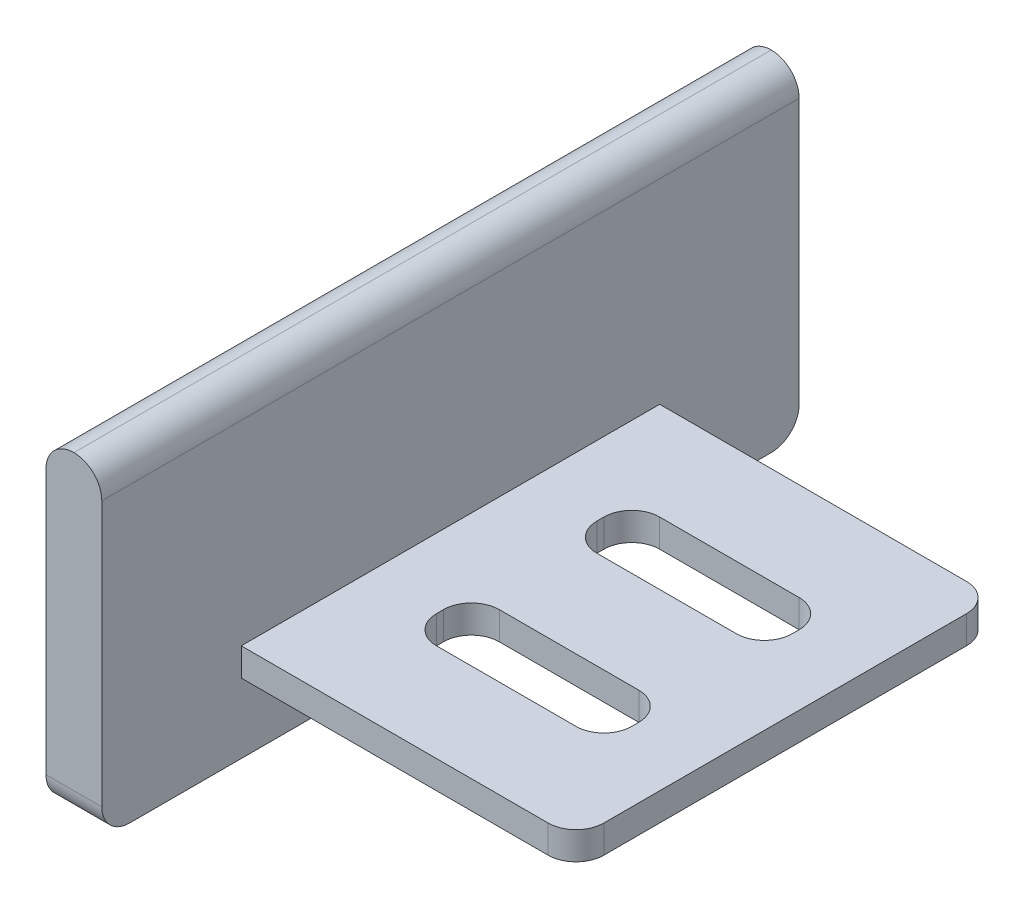
ISO-10303-21;
HEADER;
FILE_DESCRIPTION(('STEP AP214'),'2;1');
FILE_NAME('part.step','',(''),(''),'','','');
FILE_SCHEMA(('AUTOMOTIVE_DESIGN { 1 0 10303 214 1 1 1 1 }'));
ENDSEC;
DATA;
#1=APPLICATION_CONTEXT('core data for automotive mechanical design processes');
#2=APPLICATION_PROTOCOL_DEFINITION('international standard','automotive_design',2000,#1);
#3=PRODUCT_CONTEXT('',#1,'mechanical');
#4=PRODUCT('Part','Part','',(#3));
#5=PRODUCT_RELATED_PRODUCT_CATEGORY('part','',(#4));
#6=PRODUCT_DEFINITION_FORMATION('','',#4);
#7=PRODUCT_DEFINITION_CONTEXT('part definition',#1,'design');
#8=PRODUCT_DEFINITION('design','',#6,#7);
#9=PRODUCT_DEFINITION_SHAPE('','',#8);
#10=(LENGTH_UNIT() NAMED_UNIT(*) SI_UNIT(.MILLI.,.METRE.));
#11=(NAMED_UNIT(*) PLANE_ANGLE_UNIT() SI_UNIT($,.RADIAN.));
#12=(NAMED_UNIT(*) SI_UNIT($,.STERADIAN.) SOLID_ANGLE_UNIT());
#13=UNCERTAINTY_MEASURE_WITH_UNIT(LENGTH_MEASURE(1.E-05),#10,'distance_accuracy_value','');
#14=(GEOMETRIC_REPRESENTATION_CONTEXT(3) GLOBAL_UNCERTAINTY_ASSIGNED_CONTEXT((#13)) GLOBAL_UNIT_ASSIGNED_CONTEXT((#10,
#11,#12)) REPRESENTATION_CONTEXT('',''));
#15=CARTESIAN_POINT('',(0.,0.,0.));
#16=DIRECTION('',(0.,0.,1.));
#17=DIRECTION('',(1.,0.,0.));
#18=AXIS2_PLACEMENT_3D('',#15,#16,#17);
#19=CARTESIAN_POINT('',(-4.78461538461538,-1.66153846153846,2.));
#20=DIRECTION('',(1.,0.,0.));
#21=DIRECTION('',(0.,0.,-1.));
#22=AXIS2_PLACEMENT_3D('',#19,#20,#21);
#23=CYLINDRICAL_SURFACE('',#22,2.);
#24=DIRECTION('',(1.,0.,0.));
#25=VECTOR('',#24,1.);
#26=CARTESIAN_POINT('',(-4.78461538461538,-3.66153846153846,2.));
#27=LINE('',#26,#25);
#28=CARTESIAN_POINT('',(-4.78461538461538,-3.66153846153846,2.));
#29=VERTEX_POINT('',#28);
#30=CARTESIAN_POINT('',(-0.784615384615383,-3.66153846153846,2.));
#31=VERTEX_POINT('',#30);
#32=EDGE_CURVE('E397',#29,#31,#27,.T.);
#33=ORIENTED_EDGE('',*,*,#32,.F.);
#34=CARTESIAN_POINT('',(-4.78461538461538,-1.66153846153846,2.));
#35=DIRECTION('',(1.,0.,0.));
#36=DIRECTION('',(0.,1.,0.));
#37=AXIS2_PLACEMENT_3D('',#34,#35,#36);
#38=CIRCLE('',#37,2.);
#39=CARTESIAN_POINT('',(-4.78461538461538,-1.66153846153846,0.));
#40=VERTEX_POINT('',#39);
#41=EDGE_CURVE('E41',#40,#29,#38,.F.);
#42=ORIENTED_EDGE('',*,*,#41,.F.);
#43=DIRECTION('',(1.,0.,0.));
#44=VECTOR('',#43,1.);
#45=CARTESIAN_POINT('',(0.,-1.66153846153846,0.));
#46=LINE('',#45,#44);
#47=CARTESIAN_POINT('',(-0.784615384615376,-1.66153846153846,0.));
#48=VERTEX_POINT('',#47);
#49=EDGE_CURVE('E400',#48,#40,#46,.F.);
#50=ORIENTED_EDGE('',*,*,#49,.F.);
#51=CARTESIAN_POINT('',(-0.784615384615376,-1.66153846153846,2.));
#52=DIRECTION('',(-1.,0.,0.));
#53=DIRECTION('',(0.,-1.,0.));
#54=AXIS2_PLACEMENT_3D('',#51,#52,#53);
#55=CIRCLE('',#54,2.);
#56=EDGE_CURVE('E11',#31,#48,#55,.F.);
#57=ORIENTED_EDGE('',*,*,#56,.F.);
#58=EDGE_LOOP('',(#33,#42,#50,#57));
#59=FACE_BOUND('',#58,.T.);
#60=ADVANCED_FACE('F34',(#59),#23,.T.);
#61=CARTESIAN_POINT('',(0.,-1.66153846153846,48.));
#62=DIRECTION('',(-1.,0.,0.));
#63=DIRECTION('',(0.,0.,1.));
#64=AXIS2_PLACEMENT_3D('',#61,#62,#63);
#65=CYLINDRICAL_SURFACE('',#64,2.);
#66=DIRECTION('',(1.,0.,0.));
#67=VECTOR('',#66,1.);
#68=CARTESIAN_POINT('',(0.,-1.66153846153846,50.));
#69=LINE('',#68,#67);
#70=CARTESIAN_POINT('',(-4.78461538461538,-1.66153846153846,50.));
#71=VERTEX_POINT('',#70);
#72=CARTESIAN_POINT('',(-0.784615384615379,-1.66153846153846,50.));
#73=VERTEX_POINT('',#72);
#74=EDGE_CURVE('E387',#71,#73,#69,.T.);
#75=ORIENTED_EDGE('',*,*,#74,.F.);
#76=CARTESIAN_POINT('',(-4.78461538461538,-1.66153846153846,48.));
#77=DIRECTION('',(1.,0.,0.));
#78=DIRECTION('',(0.,1.,0.));
#79=AXIS2_PLACEMENT_3D('',#76,#77,#78);
#80=CIRCLE('',#79,2.);
#81=CARTESIAN_POINT('',(-4.78461538461538,-3.66153846153846,48.));
#82=VERTEX_POINT('',#81);
#83=EDGE_CURVE('E393',#82,#71,#80,.F.);
#84=ORIENTED_EDGE('',*,*,#83,.F.);
#85=DIRECTION('',(1.,0.,0.));
#86=VECTOR('',#85,1.);
#87=CARTESIAN_POINT('',(0.,-3.66153846153846,48.));
#88=LINE('',#87,#86);
#89=CARTESIAN_POINT('',(-0.784615384615383,-3.66153846153846,48.));
#90=VERTEX_POINT('',#89);
#91=EDGE_CURVE('E390',#90,#82,#88,.F.);
#92=ORIENTED_EDGE('',*,*,#91,.F.);
#93=CARTESIAN_POINT('',(-0.784615384615376,-1.66153846153846,48.));
#94=DIRECTION('',(-1.,0.,0.));
#95=DIRECTION('',(0.,-1.,0.));
#96=AXIS2_PLACEMENT_3D('',#93,#94,#95);
#97=CIRCLE('',#96,2.);
#98=EDGE_CURVE('E395',#73,#90,#97,.F.);
#99=ORIENTED_EDGE('',*,*,#98,.F.);
#100=EDGE_LOOP('',(#75,#84,#92,#99));
#101=FACE_BOUND('',#100,.T.);
#102=ADVANCED_FACE('F413',(#101),#65,.T.);
#103=CARTESIAN_POINT('',(-2.78461538461538,17.3384615384615,50.));
#104=DIRECTION('',(0.,0.,1.));
#105=DIRECTION('',(1.,0.,0.));
#106=AXIS2_PLACEMENT_3D('',#103,#104,#105);
#107=CYLINDRICAL_SURFACE('',#106,2.);
#108=DIRECTION('',(0.,0.,1.));
#109=VECTOR('',#108,1.);
#110=CARTESIAN_POINT('',(-2.78461538461538,19.3384615384615,50.));
#111=LINE('',#110,#109);
#112=CARTESIAN_POINT('',(-2.78461538461538,19.3384615384615,50.));
#113=VERTEX_POINT('',#112);
#114=CARTESIAN_POINT('',(-2.78461538461538,19.3384615384615,0.));
#115=VERTEX_POINT('',#114);
#116=EDGE_CURVE('E371',#113,#115,#111,.F.);
#117=ORIENTED_EDGE('',*,*,#116,.T.);
#118=CARTESIAN_POINT('',(-2.78461538461538,17.3384615384615,0.));
#119=DIRECTION('',(0.,0.,1.));
#120=DIRECTION('',(1.,0.,0.));
#121=AXIS2_PLACEMENT_3D('',#118,#119,#120);
#122=CIRCLE('',#121,2.);
#123=CARTESIAN_POINT('',(-4.78461538461538,17.3384615384615,0.));
#124=VERTEX_POINT('',#123);
#125=EDGE_CURVE('E383',#124,#115,#122,.F.);
#126=ORIENTED_EDGE('',*,*,#125,.F.);
#127=DIRECTION('',(0.,0.,1.));
#128=VECTOR('',#127,1.);
#129=CARTESIAN_POINT('',(-4.78461538461538,17.3384615384615,50.));
#130=LINE('',#129,#128);
#131=CARTESIAN_POINT('',(-4.78461538461538,17.3384615384615,50.));
#132=VERTEX_POINT('',#131);
#133=EDGE_CURVE('E380',#132,#124,#130,.F.);
#134=ORIENTED_EDGE('',*,*,#133,.F.);
#135=CARTESIAN_POINT('',(-2.78461538461538,17.3384615384615,50.));
#136=DIRECTION('',(0.,0.,1.));
#137=DIRECTION('',(1.,0.,0.));
#138=AXIS2_PLACEMENT_3D('',#135,#136,#137);
#139=CIRCLE('',#138,2.);
#140=EDGE_CURVE('E385',#113,#132,#139,.T.);
#141=ORIENTED_EDGE('',*,*,#140,.F.);
#142=EDGE_LOOP('',(#117,#126,#134,#141));
#143=FACE_BOUND('',#142,.T.);
#144=ADVANCED_FACE('F519',(#143),#107,.T.);
#145=CARTESIAN_POINT('',(-2.78461538461538,17.3384615384615,50.));
#146=DIRECTION('',(0.,0.,1.));
#147=DIRECTION('',(1.,0.,0.));
#148=AXIS2_PLACEMENT_3D('',#145,#146,#147);
#149=CYLINDRICAL_SURFACE('',#148,2.);
#150=DIRECTION('',(0.,0.,1.));
#151=VECTOR('',#150,1.);
#152=CARTESIAN_POINT('',(-0.784615384615379,17.3384615384615,50.));
#153=LINE('',#152,#151);
#154=CARTESIAN_POINT('',(-0.784615384615379,17.3384615384615,0.));
#155=VERTEX_POINT('',#154);
#156=CARTESIAN_POINT('',(-0.784615384615347,17.3384615384615,50.));
#157=VERTEX_POINT('',#156);
#158=EDGE_CURVE('E368',#155,#157,#153,.T.);
#159=ORIENTED_EDGE('',*,*,#158,.F.);
#160=CARTESIAN_POINT('',(-2.78461538461538,17.3384615384615,0.));
#161=DIRECTION('',(0.,0.,1.));
#162=DIRECTION('',(1.,0.,0.));
#163=AXIS2_PLACEMENT_3D('',#160,#161,#162);
#164=CIRCLE('',#163,2.);
#165=EDGE_CURVE('E374',#115,#155,#164,.F.);
#166=ORIENTED_EDGE('',*,*,#165,.F.);
#167=ORIENTED_EDGE('',*,*,#116,.F.);
#168=CARTESIAN_POINT('',(-2.78461538461538,17.3384615384615,50.));
#169=DIRECTION('',(0.,0.,1.));
#170=DIRECTION('',(1.,0.,0.));
#171=AXIS2_PLACEMENT_3D('',#168,#169,#170);
#172=CIRCLE('',#171,2.);
#173=EDGE_CURVE('E377',#157,#113,#172,.T.);
#174=ORIENTED_EDGE('',*,*,#173,.F.);
#175=EDGE_LOOP('',(#159,#166,#167,#174));
#176=FACE_BOUND('',#175,.T.);
#177=ADVANCED_FACE('F523',(#176),#149,.T.);
#178=CARTESIAN_POINT('',(16.2153846153846,-46.6615384615385,19.5));
#179=DIRECTION('',(0.,-1.,0.));
#180=DIRECTION('',(1.,0.,0.));
#181=AXIS2_PLACEMENT_3D('',#178,#179,#180);
#182=CYLINDRICAL_SURFACE('',#181,2.);
#183=DIRECTION('',(0.,1.,0.));
#184=VECTOR('',#183,1.);
#185=CARTESIAN_POINT('',(18.2153846153846,-46.6615384615385,19.5));
#186=LINE('',#185,#184);
#187=CARTESIAN_POINT('',(18.2153846153846,1.33846153846154,19.5));
#188=VERTEX_POINT('',#187);
#189=CARTESIAN_POINT('',(18.2153846153846,3.33846153846154,19.5));
#190=VERTEX_POINT('',#189);
#191=EDGE_CURVE('E358',#188,#190,#186,.T.);
#192=ORIENTED_EDGE('',*,*,#191,.F.);
#193=CARTESIAN_POINT('',(16.2153846153846,1.33846153846154,19.5));
#194=DIRECTION('',(0.,1.,0.));
#195=DIRECTION('',(-1.,0.,0.));
#196=AXIS2_PLACEMENT_3D('',#193,#194,#195);
#197=CIRCLE('',#196,2.);
#198=CARTESIAN_POINT('',(16.2153846153846,1.33846153846154,21.5));
#199=VERTEX_POINT('',#198);
#200=EDGE_CURVE('E364',#188,#199,#197,.F.);
#201=ORIENTED_EDGE('',*,*,#200,.T.);
#202=DIRECTION('',(0.,1.,0.));
#203=VECTOR('',#202,1.);
#204=CARTESIAN_POINT('',(16.2153846153846,-46.6615384615385,21.5));
#205=LINE('',#204,#203);
#206=CARTESIAN_POINT('',(16.2153846153846,3.33846153846154,21.5));
#207=VERTEX_POINT('',#206);
#208=EDGE_CURVE('E361',#207,#199,#205,.F.);
#209=ORIENTED_EDGE('',*,*,#208,.F.);
#210=CARTESIAN_POINT('',(16.2153846153846,3.33846153846154,19.5));
#211=DIRECTION('',(0.,-1.,0.));
#212=DIRECTION('',(1.,0.,0.));
#213=AXIS2_PLACEMENT_3D('',#210,#211,#212);
#214=CIRCLE('',#213,2.);
#215=EDGE_CURVE('E366',#207,#190,#214,.F.);
#216=ORIENTED_EDGE('',*,*,#215,.T.);
#217=EDGE_LOOP('',(#192,#201,#209,#216));
#218=FACE_BOUND('',#217,.T.);
#219=ADVANCED_FACE('F529',(#218),#182,.F.);
#220=CARTESIAN_POINT('',(16.2153846153846,-46.6615384615385,30.5));
#221=DIRECTION('',(0.,-1.,0.));
#222=DIRECTION('',(1.,0.,0.));
#223=AXIS2_PLACEMENT_3D('',#220,#221,#222);
#224=CYLINDRICAL_SURFACE('',#223,2.);
#225=DIRECTION('',(0.,1.,0.));
#226=VECTOR('',#225,1.);
#227=CARTESIAN_POINT('',(16.2153846153846,-46.6615384615385,28.5));
#228=LINE('',#227,#226);
#229=CARTESIAN_POINT('',(16.2153846153846,1.33846153846154,28.5));
#230=VERTEX_POINT('',#229);
#231=CARTESIAN_POINT('',(16.2153846153846,3.33846153846154,28.5));
#232=VERTEX_POINT('',#231);
#233=EDGE_CURVE('E348',#230,#232,#228,.T.);
#234=ORIENTED_EDGE('',*,*,#233,.F.);
#235=CARTESIAN_POINT('',(16.2153846153846,1.33846153846154,30.5));
#236=DIRECTION('',(0.,1.,0.));
#237=DIRECTION('',(-1.,0.,0.));
#238=AXIS2_PLACEMENT_3D('',#235,#236,#237);
#239=CIRCLE('',#238,2.);
#240=CARTESIAN_POINT('',(18.2153846153846,1.33846153846154,30.5));
#241=VERTEX_POINT('',#240);
#242=EDGE_CURVE('E354',#230,#241,#239,.F.);
#243=ORIENTED_EDGE('',*,*,#242,.T.);
#244=DIRECTION('',(0.,1.,0.));
#245=VECTOR('',#244,1.);
#246=CARTESIAN_POINT('',(18.2153846153846,-46.6615384615385,30.5));
#247=LINE('',#246,#245);
#248=CARTESIAN_POINT('',(18.2153846153846,3.33846153846154,30.5));
#249=VERTEX_POINT('',#248);
#250=EDGE_CURVE('E351',#249,#241,#247,.F.);
#251=ORIENTED_EDGE('',*,*,#250,.F.);
#252=CARTESIAN_POINT('',(16.2153846153846,3.33846153846154,30.5));
#253=DIRECTION('',(0.,-1.,0.));
#254=DIRECTION('',(1.,0.,0.));
#255=AXIS2_PLACEMENT_3D('',#252,#253,#254);
#256=CIRCLE('',#255,2.);
#257=EDGE_CURVE('E356',#249,#232,#256,.F.);
#258=ORIENTED_EDGE('',*,*,#257,.T.);
#259=EDGE_LOOP('',(#234,#243,#251,#258));
#260=FACE_BOUND('',#259,.T.);
#261=ADVANCED_FACE('F533',(#260),#224,.F.);
#262=CARTESIAN_POINT('',(16.2153846153846,-46.6615384615385,31.));
#263=DIRECTION('',(0.,1.,0.));
#264=DIRECTION('',(-1.,0.,0.));
#265=AXIS2_PLACEMENT_3D('',#262,#263,#264);
#266=CYLINDRICAL_SURFACE('',#265,2.);
#267=DIRECTION('',(0.,-1.,0.));
#268=VECTOR('',#267,1.);
#269=CARTESIAN_POINT('',(16.2153846153846,-46.6615384615385,33.));
#270=LINE('',#269,#268);
#271=CARTESIAN_POINT('',(16.2153846153846,3.33846153846154,33.));
#272=VERTEX_POINT('',#271);
#273=CARTESIAN_POINT('',(16.2153846153846,1.33846153846154,33.));
#274=VERTEX_POINT('',#273);
#275=EDGE_CURVE('E338',#272,#274,#270,.T.);
#276=ORIENTED_EDGE('',*,*,#275,.F.);
#277=CARTESIAN_POINT('',(16.2153846153846,3.33846153846154,31.));
#278=DIRECTION('',(0.,-1.,0.));
#279=DIRECTION('',(1.,0.,0.));
#280=AXIS2_PLACEMENT_3D('',#277,#278,#279);
#281=CIRCLE('',#280,2.);
#282=CARTESIAN_POINT('',(18.2153846153846,3.33846153846154,31.));
#283=VERTEX_POINT('',#282);
#284=EDGE_CURVE('E344',#272,#283,#281,.F.);
#285=ORIENTED_EDGE('',*,*,#284,.T.);
#286=DIRECTION('',(0.,-1.,0.));
#287=VECTOR('',#286,1.);
#288=CARTESIAN_POINT('',(18.2153846153846,-46.6615384615385,31.));
#289=LINE('',#288,#287);
#290=CARTESIAN_POINT('',(18.2153846153846,1.33846153846154,31.));
#291=VERTEX_POINT('',#290);
#292=EDGE_CURVE('E341',#291,#283,#289,.F.);
#293=ORIENTED_EDGE('',*,*,#292,.F.);
#294=CARTESIAN_POINT('',(16.2153846153846,1.33846153846154,31.));
#295=DIRECTION('',(0.,1.,0.));
#296=DIRECTION('',(-1.,0.,0.));
#297=AXIS2_PLACEMENT_3D('',#294,#295,#296);
#298=CIRCLE('',#297,2.);
#299=EDGE_CURVE('E346',#291,#274,#298,.F.);
#300=ORIENTED_EDGE('',*,*,#299,.T.);
#301=EDGE_LOOP('',(#276,#285,#293,#300));
#302=FACE_BOUND('',#301,.T.);
#303=ADVANCED_FACE('F537',(#302),#266,.F.);
#304=CARTESIAN_POINT('',(16.2153846153846,-46.6615384615385,19.));
#305=DIRECTION('',(0.,-1.,0.));
#306=DIRECTION('',(1.,0.,0.));
#307=AXIS2_PLACEMENT_3D('',#304,#305,#306);
#308=CYLINDRICAL_SURFACE('',#307,2.);
#309=DIRECTION('',(0.,1.,0.));
#310=VECTOR('',#309,1.);
#311=CARTESIAN_POINT('',(16.2153846153846,-46.6615384615385,17.));
#312=LINE('',#311,#310);
#313=CARTESIAN_POINT('',(16.2153846153846,1.33846153846154,17.));
#314=VERTEX_POINT('',#313);
#315=CARTESIAN_POINT('',(16.2153846153846,3.33846153846154,17.));
#316=VERTEX_POINT('',#315);
#317=EDGE_CURVE('E327',#314,#316,#312,.T.);
#318=ORIENTED_EDGE('',*,*,#317,.F.);
#319=CARTESIAN_POINT('',(16.2153846153846,1.33846153846154,19.));
#320=DIRECTION('',(0.,1.,0.));
#321=DIRECTION('',(-1.,0.,0.));
#322=AXIS2_PLACEMENT_3D('',#319,#320,#321);
#323=CIRCLE('',#322,2.);
#324=CARTESIAN_POINT('',(18.2153846153846,1.33846153846154,19.));
#325=VERTEX_POINT('',#324);
#326=EDGE_CURVE('E333',#314,#325,#323,.F.);
#327=ORIENTED_EDGE('',*,*,#326,.T.);
#328=DIRECTION('',(0.,1.,0.));
#329=VECTOR('',#328,1.);
#330=CARTESIAN_POINT('',(18.2153846153846,-46.6615384615385,19.));
#331=LINE('',#330,#329);
#332=CARTESIAN_POINT('',(18.2153846153846,3.33846153846154,19.));
#333=VERTEX_POINT('',#332);
#334=EDGE_CURVE('E330',#333,#325,#331,.F.);
#335=ORIENTED_EDGE('',*,*,#334,.F.);
#336=CARTESIAN_POINT('',(16.2153846153846,3.33846153846154,19.));
#337=DIRECTION('',(0.,-1.,0.));
#338=DIRECTION('',(1.,0.,0.));
#339=AXIS2_PLACEMENT_3D('',#336,#337,#338);
#340=CIRCLE('',#339,2.);
#341=EDGE_CURVE('E336',#333,#316,#340,.F.);
#342=ORIENTED_EDGE('',*,*,#341,.T.);
#343=EDGE_LOOP('',(#318,#327,#335,#342));
#344=FACE_BOUND('',#343,.T.);
#345=ADVANCED_FACE('F541',(#344),#308,.F.);
#346=CARTESIAN_POINT('',(6.21538461538463,-46.6615384615385,19.5));
#347=DIRECTION('',(0.,-1.,0.));
#348=DIRECTION('',(1.,0.,0.));
#349=AXIS2_PLACEMENT_3D('',#346,#347,#348);
#350=CYLINDRICAL_SURFACE('',#349,2.);
#351=DIRECTION('',(0.,1.,0.));
#352=VECTOR('',#351,1.);
#353=CARTESIAN_POINT('',(6.21538461538463,-46.6615384615385,21.5));
#354=LINE('',#353,#352);
#355=CARTESIAN_POINT('',(6.21538461538463,1.33846153846154,21.5));
#356=VERTEX_POINT('',#355);
#357=CARTESIAN_POINT('',(6.21538461538463,3.33846153846154,21.5));
#358=VERTEX_POINT('',#357);
#359=EDGE_CURVE('E317',#356,#358,#354,.T.);
#360=ORIENTED_EDGE('',*,*,#359,.F.);
#361=CARTESIAN_POINT('',(6.21538461538462,1.33846153846154,19.5));
#362=DIRECTION('',(0.,1.,0.));
#363=DIRECTION('',(-1.,0.,0.));
#364=AXIS2_PLACEMENT_3D('',#361,#362,#363);
#365=CIRCLE('',#364,2.);
#366=CARTESIAN_POINT('',(4.21538461538463,1.33846153846154,19.5));
#367=VERTEX_POINT('',#366);
#368=EDGE_CURVE('E323',#356,#367,#365,.F.);
#369=ORIENTED_EDGE('',*,*,#368,.T.);
#370=DIRECTION('',(0.,1.,0.));
#371=VECTOR('',#370,1.);
#372=CARTESIAN_POINT('',(4.21538461538463,-46.6615384615385,19.5));
#373=LINE('',#372,#371);
#374=CARTESIAN_POINT('',(4.21538461538462,3.33846153846153,19.5));
#375=VERTEX_POINT('',#374);
#376=EDGE_CURVE('E320',#375,#367,#373,.F.);
#377=ORIENTED_EDGE('',*,*,#376,.F.);
#378=CARTESIAN_POINT('',(6.21538461538462,3.33846153846154,19.5));
#379=DIRECTION('',(0.,-1.,0.));
#380=DIRECTION('',(1.,0.,0.));
#381=AXIS2_PLACEMENT_3D('',#378,#379,#380);
#382=CIRCLE('',#381,2.);
#383=EDGE_CURVE('E325',#375,#358,#382,.F.);
#384=ORIENTED_EDGE('',*,*,#383,.T.);
#385=EDGE_LOOP('',(#360,#369,#377,#384));
#386=FACE_BOUND('',#385,.T.);
#387=ADVANCED_FACE('F545',(#386),#350,.F.);
#388=CARTESIAN_POINT('',(6.21538461538463,-46.6615384615385,19.));
#389=DIRECTION('',(0.,1.,0.));
#390=DIRECTION('',(-1.,0.,0.));
#391=AXIS2_PLACEMENT_3D('',#388,#389,#390);
#392=CYLINDRICAL_SURFACE('',#391,2.);
#393=DIRECTION('',(0.,-1.,0.));
#394=VECTOR('',#393,1.);
#395=CARTESIAN_POINT('',(6.21538461538463,-46.6615384615385,17.));
#396=LINE('',#395,#394);
#397=CARTESIAN_POINT('',(6.21538461538462,3.33846153846154,17.));
#398=VERTEX_POINT('',#397);
#399=CARTESIAN_POINT('',(6.21538461538463,1.33846153846154,17.));
#400=VERTEX_POINT('',#399);
#401=EDGE_CURVE('E306',#398,#400,#396,.T.);
#402=ORIENTED_EDGE('',*,*,#401,.F.);
#403=CARTESIAN_POINT('',(6.21538461538463,3.33846153846154,19.));
#404=DIRECTION('',(0.,-1.,0.));
#405=DIRECTION('',(1.,0.,0.));
#406=AXIS2_PLACEMENT_3D('',#403,#404,#405);
#407=CIRCLE('',#406,2.);
#408=CARTESIAN_POINT('',(4.21538461538463,3.33846153846153,19.));
#409=VERTEX_POINT('',#408);
#410=EDGE_CURVE('E312',#398,#409,#407,.F.);
#411=ORIENTED_EDGE('',*,*,#410,.T.);
#412=DIRECTION('',(0.,-1.,0.));
#413=VECTOR('',#412,1.);
#414=CARTESIAN_POINT('',(4.21538461538463,-46.6615384615385,19.));
#415=LINE('',#414,#413);
#416=CARTESIAN_POINT('',(4.21538461538463,1.33846153846154,19.));
#417=VERTEX_POINT('',#416);
#418=EDGE_CURVE('E309',#417,#409,#415,.F.);
#419=ORIENTED_EDGE('',*,*,#418,.F.);
#420=CARTESIAN_POINT('',(6.21538461538463,1.33846153846154,19.));
#421=DIRECTION('',(0.,1.,0.));
#422=DIRECTION('',(-1.,0.,0.));
#423=AXIS2_PLACEMENT_3D('',#420,#421,#422);
#424=CIRCLE('',#423,2.);
#425=EDGE_CURVE('E314',#417,#400,#424,.F.);
#426=ORIENTED_EDGE('',*,*,#425,.T.);
#427=EDGE_LOOP('',(#402,#411,#419,#426));
#428=FACE_BOUND('',#427,.T.);
#429=ADVANCED_FACE('F549',(#428),#392,.F.);
#430=CARTESIAN_POINT('',(6.21538461538463,-46.6615384615385,31.));
#431=DIRECTION('',(0.,1.,0.));
#432=DIRECTION('',(-1.,0.,0.));
#433=AXIS2_PLACEMENT_3D('',#430,#431,#432);
#434=CYLINDRICAL_SURFACE('',#433,2.);
#435=DIRECTION('',(0.,-1.,0.));
#436=VECTOR('',#435,1.);
#437=CARTESIAN_POINT('',(4.21538461538463,-46.6615384615385,31.));
#438=LINE('',#437,#436);
#439=CARTESIAN_POINT('',(4.21538461538463,3.33846153846153,31.));
#440=VERTEX_POINT('',#439);
#441=CARTESIAN_POINT('',(4.21538461538463,1.33846153846154,31.));
#442=VERTEX_POINT('',#441);
#443=EDGE_CURVE('E296',#440,#442,#438,.T.);
#444=ORIENTED_EDGE('',*,*,#443,.F.);
#445=CARTESIAN_POINT('',(6.21538461538463,3.33846153846154,31.));
#446=DIRECTION('',(0.,-1.,0.));
#447=DIRECTION('',(1.,0.,0.));
#448=AXIS2_PLACEMENT_3D('',#445,#446,#447);
#449=CIRCLE('',#448,2.);
#450=CARTESIAN_POINT('',(6.21538461538462,3.33846153846154,33.));
#451=VERTEX_POINT('',#450);
#452=EDGE_CURVE('E302',#440,#451,#449,.F.);
#453=ORIENTED_EDGE('',*,*,#452,.T.);
#454=DIRECTION('',(0.,-1.,0.));
#455=VECTOR('',#454,1.);
#456=CARTESIAN_POINT('',(6.21538461538463,-46.6615384615385,33.));
#457=LINE('',#456,#455);
#458=CARTESIAN_POINT('',(6.21538461538463,1.33846153846154,33.));
#459=VERTEX_POINT('',#458);
#460=EDGE_CURVE('E299',#459,#451,#457,.F.);
#461=ORIENTED_EDGE('',*,*,#460,.F.);
#462=CARTESIAN_POINT('',(6.21538461538463,1.33846153846154,31.));
#463=DIRECTION('',(0.,1.,0.));
#464=DIRECTION('',(-1.,0.,0.));
#465=AXIS2_PLACEMENT_3D('',#462,#463,#464);
#466=CIRCLE('',#465,2.);
#467=EDGE_CURVE('E304',#459,#442,#466,.F.);
#468=ORIENTED_EDGE('',*,*,#467,.T.);
#469=EDGE_LOOP('',(#444,#453,#461,#468));
#470=FACE_BOUND('',#469,.T.);
#471=ADVANCED_FACE('F553',(#470),#434,.F.);
#472=CARTESIAN_POINT('',(6.21538461538463,-46.6615384615385,30.5));
#473=DIRECTION('',(0.,-1.,0.));
#474=DIRECTION('',(1.,0.,0.));
#475=AXIS2_PLACEMENT_3D('',#472,#473,#474);
#476=CYLINDRICAL_SURFACE('',#475,2.);
#477=DIRECTION('',(0.,1.,0.));
#478=VECTOR('',#477,1.);
#479=CARTESIAN_POINT('',(4.21538461538463,-46.6615384615385,30.5));
#480=LINE('',#479,#478);
#481=CARTESIAN_POINT('',(4.21538461538463,1.33846153846154,30.5));
#482=VERTEX_POINT('',#481);
#483=CARTESIAN_POINT('',(4.21538461538462,3.33846153846153,30.5));
#484=VERTEX_POINT('',#483);
#485=EDGE_CURVE('E285',#482,#484,#480,.T.);
#486=ORIENTED_EDGE('',*,*,#485,.F.);
#487=CARTESIAN_POINT('',(6.21538461538462,1.33846153846154,30.5));
#488=DIRECTION('',(0.,1.,0.));
#489=DIRECTION('',(-1.,0.,0.));
#490=AXIS2_PLACEMENT_3D('',#487,#488,#489);
#491=CIRCLE('',#490,2.);
#492=CARTESIAN_POINT('',(6.21538461538463,1.33846153846154,28.5));
#493=VERTEX_POINT('',#492);
#494=EDGE_CURVE('E291',#482,#493,#491,.F.);
#495=ORIENTED_EDGE('',*,*,#494,.T.);
#496=DIRECTION('',(0.,1.,0.));
#497=VECTOR('',#496,1.);
#498=CARTESIAN_POINT('',(6.21538461538463,-46.6615384615385,28.5));
#499=LINE('',#498,#497);
#500=CARTESIAN_POINT('',(6.21538461538463,3.33846153846154,28.5));
#501=VERTEX_POINT('',#500);
#502=EDGE_CURVE('E288',#501,#493,#499,.F.);
#503=ORIENTED_EDGE('',*,*,#502,.F.);
#504=CARTESIAN_POINT('',(6.21538461538462,3.33846153846154,30.5));
#505=DIRECTION('',(0.,-1.,0.));
#506=DIRECTION('',(1.,0.,0.));
#507=AXIS2_PLACEMENT_3D('',#504,#505,#506);
#508=CIRCLE('',#507,2.);
#509=EDGE_CURVE('E294',#501,#484,#508,.F.);
#510=ORIENTED_EDGE('',*,*,#509,.T.);
#511=EDGE_LOOP('',(#486,#495,#503,#510));
#512=FACE_BOUND('',#511,.T.);
#513=ADVANCED_FACE('F557',(#512),#476,.F.);
#514=CARTESIAN_POINT('',(21.2153846153846,-46.6615384615385,12.));
#515=DIRECTION('',(0.,-1.,0.));
#516=DIRECTION('',(0.,0.,-1.));
#517=AXIS2_PLACEMENT_3D('',#514,#515,#516);
#518=CYLINDRICAL_SURFACE('',#517,2.);
#519=DIRECTION('',(0.,-1.,0.));
#520=VECTOR('',#519,1.);
#521=CARTESIAN_POINT('',(21.2153846153846,-46.6615384615385,10.));
#522=LINE('',#521,#520);
#523=CARTESIAN_POINT('',(21.2153846153846,3.33846153846154,10.));
#524=VERTEX_POINT('',#523);
#525=CARTESIAN_POINT('',(21.2153846153846,1.33846153846154,10.));
#526=VERTEX_POINT('',#525);
#527=EDGE_CURVE('E275',#524,#526,#522,.T.);
#528=ORIENTED_EDGE('',*,*,#527,.F.);
#529=CARTESIAN_POINT('',(21.2153846153846,3.33846153846154,12.));
#530=DIRECTION('',(0.,-1.,0.));
#531=DIRECTION('',(1.,0.,0.));
#532=AXIS2_PLACEMENT_3D('',#529,#530,#531);
#533=CIRCLE('',#532,2.);
#534=CARTESIAN_POINT('',(23.2153846153846,3.33846153846154,12.));
#535=VERTEX_POINT('',#534);
#536=EDGE_CURVE('E281',#535,#524,#533,.F.);
#537=ORIENTED_EDGE('',*,*,#536,.F.);
#538=DIRECTION('',(0.,-1.,0.));
#539=VECTOR('',#538,1.);
#540=CARTESIAN_POINT('',(23.2153846153846,1.33846153846154,12.));
#541=LINE('',#540,#539);
#542=CARTESIAN_POINT('',(23.2153846153846,1.33846153846154,12.));
#543=VERTEX_POINT('',#542);
#544=EDGE_CURVE('E278',#543,#535,#541,.F.);
#545=ORIENTED_EDGE('',*,*,#544,.F.);
#546=CARTESIAN_POINT('',(21.2153846153846,1.33846153846154,12.));
#547=DIRECTION('',(0.,1.,0.));
#548=DIRECTION('',(-1.,0.,0.));
#549=AXIS2_PLACEMENT_3D('',#546,#547,#548);
#550=CIRCLE('',#549,2.);
#551=EDGE_CURVE('E283',#526,#543,#550,.F.);
#552=ORIENTED_EDGE('',*,*,#551,.F.);
#553=EDGE_LOOP('',(#528,#537,#545,#552));
#554=FACE_BOUND('',#553,.T.);
#555=ADVANCED_FACE('F561',(#554),#518,.T.);
#556=CARTESIAN_POINT('',(21.2153846153846,-46.6615384615385,38.));
#557=DIRECTION('',(0.,1.,0.));
#558=DIRECTION('',(0.,0.,1.));
#559=AXIS2_PLACEMENT_3D('',#556,#557,#558);
#560=CYLINDRICAL_SURFACE('',#559,2.);
#561=DIRECTION('',(0.,1.,0.));
#562=VECTOR('',#561,1.);
#563=CARTESIAN_POINT('',(21.2153846153846,-46.6615384615385,40.));
#564=LINE('',#563,#562);
#565=CARTESIAN_POINT('',(21.2153846153846,1.33846153846154,40.));
#566=VERTEX_POINT('',#565);
#567=CARTESIAN_POINT('',(21.2153846153846,3.33846153846154,40.));
#568=VERTEX_POINT('',#567);
#569=EDGE_CURVE('E229',#566,#568,#564,.T.);
#570=ORIENTED_EDGE('',*,*,#569,.F.);
#571=CARTESIAN_POINT('',(21.2153846153846,1.33846153846154,38.));
#572=DIRECTION('',(0.,1.,0.));
#573=DIRECTION('',(-1.,0.,0.));
#574=AXIS2_PLACEMENT_3D('',#571,#572,#573);
#575=CIRCLE('',#574,2.);
#576=CARTESIAN_POINT('',(23.2153846153846,1.33846153846154,38.));
#577=VERTEX_POINT('',#576);
#578=EDGE_CURVE('E271',#577,#566,#575,.F.);
#579=ORIENTED_EDGE('',*,*,#578,.F.);
#580=DIRECTION('',(0.,1.,0.));
#581=VECTOR('',#580,1.);
#582=CARTESIAN_POINT('',(23.2153846153846,1.33846153846154,38.));
#583=LINE('',#582,#581);
#584=CARTESIAN_POINT('',(23.2153846153846,3.33846153846154,38.));
#585=VERTEX_POINT('',#584);
#586=EDGE_CURVE('E268',#585,#577,#583,.F.);
#587=ORIENTED_EDGE('',*,*,#586,.F.);
#588=CARTESIAN_POINT('',(21.2153846153846,3.33846153846154,38.));
#589=DIRECTION('',(0.,-1.,0.));
#590=DIRECTION('',(1.,0.,0.));
#591=AXIS2_PLACEMENT_3D('',#588,#589,#590);
#592=CIRCLE('',#591,2.);
#593=EDGE_CURVE('E273',#568,#585,#592,.F.);
#594=ORIENTED_EDGE('',*,*,#593,.F.);
#595=EDGE_LOOP('',(#570,#579,#587,#594));
#596=FACE_BOUND('',#595,.T.);
#597=ADVANCED_FACE('F565',(#596),#560,.T.);
#598=CARTESIAN_POINT('',(-4.78461538461538,19.3384615384615,50.));
#599=DIRECTION('',(1.,0.,0.));
#600=DIRECTION('',(0.,1.,0.));
#601=AXIS2_PLACEMENT_3D('',#598,#599,#600);
#602=PLANE('',#601);
#603=DIRECTION('',(0.,-1.,0.));
#604=VECTOR('',#603,1.);
#605=CARTESIAN_POINT('',(-4.78461538461538,19.3384615384615,0.));
#606=LINE('',#605,#604);
#607=EDGE_CURVE('E406',#124,#40,#606,.T.);
#608=ORIENTED_EDGE('',*,*,#607,.T.);
#609=ORIENTED_EDGE('',*,*,#41,.T.);
#610=DIRECTION('',(0.,0.,-1.));
#611=VECTOR('',#610,1.);
#612=CARTESIAN_POINT('',(-4.78461538461538,-3.66153846153846,50.));
#613=LINE('',#612,#611);
#614=EDGE_CURVE('E264',#82,#29,#613,.T.);
#615=ORIENTED_EDGE('',*,*,#614,.F.);
#616=ORIENTED_EDGE('',*,*,#83,.T.);
#617=DIRECTION('',(0.,-1.,0.));
#618=VECTOR('',#617,1.);
#619=CARTESIAN_POINT('',(-4.78461538461538,19.3384615384615,50.));
#620=LINE('',#619,#618);
#621=EDGE_CURVE('E253',#132,#71,#620,.T.);
#622=ORIENTED_EDGE('',*,*,#621,.F.);
#623=ORIENTED_EDGE('',*,*,#133,.T.);
#624=EDGE_LOOP('',(#608,#609,#615,#616,#622,#623));
#625=FACE_BOUND('',#624,.T.);
#626=ADVANCED_FACE('F404',(#625),#602,.F.);
#627=CARTESIAN_POINT('',(-4.78461538461538,-3.66153846153846,50.));
#628=DIRECTION('',(0.,1.,0.));
#629=DIRECTION('',(0.,0.,1.));
#630=AXIS2_PLACEMENT_3D('',#627,#628,#629);
#631=PLANE('',#630);
#632=CARTESIAN_POINT('',(-2.78461538461538,-3.66153846153846,42.5));
#633=DIRECTION('',(0.,-1.,0.));
#634=DIRECTION('',(0.,0.,-1.));
#635=AXIS2_PLACEMENT_3D('',#632,#633,#634);
#636=CIRCLE('',#635,1.);
#637=CARTESIAN_POINT('',(-2.78461538461538,-3.66153846153846,41.5));
#638=VERTEX_POINT('',#637);
#639=EDGE_CURVE('E478',#638,#638,#636,.T.);
#640=ORIENTED_EDGE('',*,*,#639,.F.);
#641=EDGE_LOOP('',(#640));
#642=FACE_BOUND('',#641,.T.);
#643=CARTESIAN_POINT('',(-2.78461538461538,-3.66153846153846,7.5));
#644=DIRECTION('',(0.,-1.,0.));
#645=DIRECTION('',(0.,0.,1.));
#646=AXIS2_PLACEMENT_3D('',#643,#644,#645);
#647=CIRCLE('',#646,1.);
#648=CARTESIAN_POINT('',(-2.78461538461538,-3.66153846153846,8.5));
#649=VERTEX_POINT('',#648);
#650=EDGE_CURVE('E472',#649,#649,#647,.T.);
#651=ORIENTED_EDGE('',*,*,#650,.F.);
#652=EDGE_LOOP('',(#651));
#653=FACE_BOUND('',#652,.T.);
#654=ORIENTED_EDGE('',*,*,#614,.T.);
#655=ORIENTED_EDGE('',*,*,#32,.T.);
#656=DIRECTION('',(0.,0.,-1.));
#657=VECTOR('',#656,1.);
#658=CARTESIAN_POINT('',(-0.784615384615383,-3.66153846153846,50.));
#659=LINE('',#658,#657);
#660=EDGE_CURVE('E262',#90,#31,#659,.T.);
#661=ORIENTED_EDGE('',*,*,#660,.F.);
#662=ORIENTED_EDGE('',*,*,#91,.T.);
#663=EDGE_LOOP('',(#654,#655,#661,#662));
#664=FACE_BOUND('',#663,.T.);
#665=ADVANCED_FACE('F409',(#642,#653,#664),#631,.F.);
#666=CARTESIAN_POINT('',(-0.784615384615374,1.33846153846154,50.));
#667=DIRECTION('',(0.,1.,0.));
#668=DIRECTION('',(-1.,0.,0.));
#669=AXIS2_PLACEMENT_3D('',#666,#667,#668);
#670=PLANE('',#669);
#671=ORIENTED_EDGE('',*,*,#200,.F.);
#672=DIRECTION('',(0.,0.,-1.));
#673=VECTOR('',#672,1.);
#674=CARTESIAN_POINT('',(18.2153846153846,1.33846153846154,50.));
#675=LINE('',#674,#673);
#676=EDGE_CURVE('E444',#188,#325,#675,.T.);
#677=ORIENTED_EDGE('',*,*,#676,.T.);
#678=ORIENTED_EDGE('',*,*,#326,.F.);
#679=DIRECTION('',(-1.,0.,0.));
#680=VECTOR('',#679,1.);
#681=CARTESIAN_POINT('',(-0.784615384615374,1.33846153846154,17.));
#682=LINE('',#681,#680);
#683=EDGE_CURVE('E442',#314,#400,#682,.T.);
#684=ORIENTED_EDGE('',*,*,#683,.T.);
#685=ORIENTED_EDGE('',*,*,#425,.F.);
#686=DIRECTION('',(0.,0.,1.));
#687=VECTOR('',#686,1.);
#688=CARTESIAN_POINT('',(4.21538461538462,1.33846153846154,50.));
#689=LINE('',#688,#687);
#690=EDGE_CURVE('E439',#417,#367,#689,.T.);
#691=ORIENTED_EDGE('',*,*,#690,.T.);
#692=ORIENTED_EDGE('',*,*,#368,.F.);
#693=DIRECTION('',(1.,0.,0.));
#694=VECTOR('',#693,1.);
#695=CARTESIAN_POINT('',(-0.784615384615374,1.33846153846154,21.5));
#696=LINE('',#695,#694);
#697=EDGE_CURVE('E436',#356,#199,#696,.T.);
#698=ORIENTED_EDGE('',*,*,#697,.T.);
#699=EDGE_LOOP('',(#671,#677,#678,#684,#685,#691,#692,#698));
#700=FACE_BOUND('',#699,.T.);
#701=ORIENTED_EDGE('',*,*,#242,.F.);
#702=DIRECTION('',(-1.,0.,0.));
#703=VECTOR('',#702,1.);
#704=CARTESIAN_POINT('',(-0.784615384615374,1.33846153846154,28.5));
#705=LINE('',#704,#703);
#706=EDGE_CURVE('E425',#230,#493,#705,.T.);
#707=ORIENTED_EDGE('',*,*,#706,.T.);
#708=ORIENTED_EDGE('',*,*,#494,.F.);
#709=DIRECTION('',(0.,0.,1.));
#710=VECTOR('',#709,1.);
#711=CARTESIAN_POINT('',(4.21538461538463,1.33846153846154,50.));
#712=LINE('',#711,#710);
#713=EDGE_CURVE('E422',#482,#442,#712,.T.);
#714=ORIENTED_EDGE('',*,*,#713,.T.);
#715=ORIENTED_EDGE('',*,*,#467,.F.);
#716=DIRECTION('',(1.,0.,0.));
#717=VECTOR('',#716,1.);
#718=CARTESIAN_POINT('',(-0.784615384615374,1.33846153846154,33.));
#719=LINE('',#718,#717);
#720=EDGE_CURVE('E433',#459,#274,#719,.T.);
#721=ORIENTED_EDGE('',*,*,#720,.T.);
#722=ORIENTED_EDGE('',*,*,#299,.F.);
#723=DIRECTION('',(0.,0.,-1.));
#724=VECTOR('',#723,1.);
#725=CARTESIAN_POINT('',(18.2153846153846,1.33846153846154,50.));
#726=LINE('',#725,#724);
#727=EDGE_CURVE('E428',#291,#241,#726,.T.);
#728=ORIENTED_EDGE('',*,*,#727,.T.);
#729=EDGE_LOOP('',(#701,#707,#708,#714,#715,#721,#722,#728));
#730=FACE_BOUND('',#729,.T.);
#731=DIRECTION('',(1.,0.,0.));
#732=VECTOR('',#731,1.);
#733=CARTESIAN_POINT('',(-0.784615384615374,1.33846153846154,10.));
#734=LINE('',#733,#732);
#735=CARTESIAN_POINT('',(-0.784615384615376,1.33846153846154,10.));
#736=VERTEX_POINT('',#735);
#737=EDGE_CURVE('E241',#736,#526,#734,.T.);
#738=ORIENTED_EDGE('',*,*,#737,.T.);
#739=ORIENTED_EDGE('',*,*,#551,.T.);
#740=DIRECTION('',(0.,0.,-1.));
#741=VECTOR('',#740,1.);
#742=CARTESIAN_POINT('',(23.2153846153846,1.33846153846154,50.));
#743=LINE('',#742,#741);
#744=EDGE_CURVE('E251',#577,#543,#743,.T.);
#745=ORIENTED_EDGE('',*,*,#744,.F.);
#746=ORIENTED_EDGE('',*,*,#578,.T.);
#747=DIRECTION('',(-1.,0.,0.));
#748=VECTOR('',#747,1.);
#749=CARTESIAN_POINT('',(-0.784615384615374,1.33846153846154,40.));
#750=LINE('',#749,#748);
#751=CARTESIAN_POINT('',(-0.784615384615376,1.33846153846154,40.));
#752=VERTEX_POINT('',#751);
#753=EDGE_CURVE('E420',#566,#752,#750,.T.);
#754=ORIENTED_EDGE('',*,*,#753,.T.);
#755=DIRECTION('',(0.,0.,-1.));
#756=VECTOR('',#755,1.);
#757=CARTESIAN_POINT('',(-0.784615384615374,1.33846153846154,50.));
#758=LINE('',#757,#756);
#759=EDGE_CURVE('E240',#752,#736,#758,.T.);
#760=ORIENTED_EDGE('',*,*,#759,.T.);
#761=EDGE_LOOP('',(#738,#739,#745,#746,#754,#760));
#762=FACE_BOUND('',#761,.T.);
#763=ADVANCED_FACE('F495',(#700,#730,#762),#670,.F.);
#764=CARTESIAN_POINT('',(23.2153846153846,1.33846153846154,50.));
#765=DIRECTION('',(-1.,0.,0.));
#766=DIRECTION('',(0.,0.,1.));
#767=AXIS2_PLACEMENT_3D('',#764,#765,#766);
#768=PLANE('',#767);
#769=ORIENTED_EDGE('',*,*,#744,.T.);
#770=ORIENTED_EDGE('',*,*,#544,.T.);
#771=DIRECTION('',(0.,0.,-1.));
#772=VECTOR('',#771,1.);
#773=CARTESIAN_POINT('',(23.2153846153846,3.33846153846154,50.));
#774=LINE('',#773,#772);
#775=EDGE_CURVE('E248',#585,#535,#774,.T.);
#776=ORIENTED_EDGE('',*,*,#775,.F.);
#777=ORIENTED_EDGE('',*,*,#586,.T.);
#778=EDGE_LOOP('',(#769,#770,#776,#777));
#779=FACE_BOUND('',#778,.T.);
#780=ADVANCED_FACE('F574',(#779),#768,.F.);
#781=CARTESIAN_POINT('',(23.2153846153846,3.33846153846154,50.));
#782=DIRECTION('',(0.,-1.,0.));
#783=DIRECTION('',(1.,0.,0.));
#784=AXIS2_PLACEMENT_3D('',#781,#782,#783);
#785=PLANE('',#784);
#786=DIRECTION('',(1.,0.,0.));
#787=VECTOR('',#786,1.);
#788=CARTESIAN_POINT('',(4.21538461538463,3.33846153846153,33.));
#789=LINE('',#788,#787);
#790=EDGE_CURVE('E467',#451,#272,#789,.T.);
#791=ORIENTED_EDGE('',*,*,#790,.F.);
#792=ORIENTED_EDGE('',*,*,#452,.F.);
#793=DIRECTION('',(0.,0.,1.));
#794=VECTOR('',#793,1.);
#795=CARTESIAN_POINT('',(4.21538461538462,3.33846153846153,28.5));
#796=LINE('',#795,#794);
#797=EDGE_CURVE('E456',#484,#440,#796,.T.);
#798=ORIENTED_EDGE('',*,*,#797,.F.);
#799=ORIENTED_EDGE('',*,*,#509,.F.);
#800=DIRECTION('',(-1.,0.,0.));
#801=VECTOR('',#800,1.);
#802=CARTESIAN_POINT('',(18.2153846153846,3.33846153846154,28.5));
#803=LINE('',#802,#801);
#804=EDGE_CURVE('E232',#232,#501,#803,.T.);
#805=ORIENTED_EDGE('',*,*,#804,.F.);
#806=ORIENTED_EDGE('',*,*,#257,.F.);
#807=DIRECTION('',(0.,0.,-1.));
#808=VECTOR('',#807,1.);
#809=CARTESIAN_POINT('',(18.2153846153846,3.33846153846154,33.));
#810=LINE('',#809,#808);
#811=EDGE_CURVE('E464',#283,#249,#810,.T.);
#812=ORIENTED_EDGE('',*,*,#811,.F.);
#813=ORIENTED_EDGE('',*,*,#284,.F.);
#814=EDGE_LOOP('',(#791,#792,#798,#799,#805,#806,#812,#813));
#815=FACE_BOUND('',#814,.T.);
#816=DIRECTION('',(0.,0.,-1.));
#817=VECTOR('',#816,1.);
#818=CARTESIAN_POINT('',(18.2153846153846,3.33846153846154,17.));
#819=LINE('',#818,#817);
#820=EDGE_CURVE('E459',#190,#333,#819,.T.);
#821=ORIENTED_EDGE('',*,*,#820,.F.);
#822=ORIENTED_EDGE('',*,*,#215,.F.);
#823=DIRECTION('',(1.,0.,0.));
#824=VECTOR('',#823,1.);
#825=CARTESIAN_POINT('',(18.2153846153846,3.33846153846154,21.5));
#826=LINE('',#825,#824);
#827=EDGE_CURVE('E450',#358,#207,#826,.T.);
#828=ORIENTED_EDGE('',*,*,#827,.F.);
#829=ORIENTED_EDGE('',*,*,#383,.F.);
#830=DIRECTION('',(0.,0.,1.));
#831=VECTOR('',#830,1.);
#832=CARTESIAN_POINT('',(4.21538461538462,3.33846153846153,21.5));
#833=LINE('',#832,#831);
#834=EDGE_CURVE('E453',#409,#375,#833,.T.);
#835=ORIENTED_EDGE('',*,*,#834,.F.);
#836=ORIENTED_EDGE('',*,*,#410,.F.);
#837=DIRECTION('',(-1.,0.,0.));
#838=VECTOR('',#837,1.);
#839=CARTESIAN_POINT('',(4.21538461538463,3.33846153846153,17.));
#840=LINE('',#839,#838);
#841=EDGE_CURVE('E457',#316,#398,#840,.T.);
#842=ORIENTED_EDGE('',*,*,#841,.F.);
#843=ORIENTED_EDGE('',*,*,#341,.F.);
#844=EDGE_LOOP('',(#821,#822,#828,#829,#835,#836,#842,#843));
#845=FACE_BOUND('',#844,.T.);
#846=ORIENTED_EDGE('',*,*,#775,.T.);
#847=ORIENTED_EDGE('',*,*,#536,.T.);
#848=DIRECTION('',(1.,0.,0.));
#849=VECTOR('',#848,1.);
#850=CARTESIAN_POINT('',(-0.784615384615377,3.33846153846153,10.));
#851=LINE('',#850,#849);
#852=CARTESIAN_POINT('',(-0.784615384615377,3.33846153846153,10.));
#853=VERTEX_POINT('',#852);
#854=EDGE_CURVE('E247',#853,#524,#851,.T.);
#855=ORIENTED_EDGE('',*,*,#854,.F.);
#856=DIRECTION('',(0.,0.,-1.));
#857=VECTOR('',#856,1.);
#858=CARTESIAN_POINT('',(-0.784615384615377,3.33846153846153,50.));
#859=LINE('',#858,#857);
#860=CARTESIAN_POINT('',(-0.784615384615377,3.33846153846153,40.));
#861=VERTEX_POINT('',#860);
#862=EDGE_CURVE('E238',#861,#853,#859,.T.);
#863=ORIENTED_EDGE('',*,*,#862,.F.);
#864=DIRECTION('',(-1.,0.,0.));
#865=VECTOR('',#864,1.);
#866=CARTESIAN_POINT('',(-0.784615384615377,3.33846153846153,40.));
#867=LINE('',#866,#865);
#868=EDGE_CURVE('E222',#568,#861,#867,.T.);
#869=ORIENTED_EDGE('',*,*,#868,.F.);
#870=ORIENTED_EDGE('',*,*,#593,.T.);
#871=EDGE_LOOP('',(#846,#847,#855,#863,#869,#870));
#872=FACE_BOUND('',#871,.T.);
#873=ADVANCED_FACE('F245',(#815,#845,#872),#785,.F.);
#874=CARTESIAN_POINT('',(-0.784615384615377,3.33846153846153,50.));
#875=DIRECTION('',(-1.,0.,0.));
#876=DIRECTION('',(0.,-1.,0.));
#877=AXIS2_PLACEMENT_3D('',#874,#875,#876);
#878=PLANE('',#877);
#879=ORIENTED_EDGE('',*,*,#660,.T.);
#880=ORIENTED_EDGE('',*,*,#56,.T.);
#881=DIRECTION('',(0.,1.,0.));
#882=VECTOR('',#881,1.);
#883=CARTESIAN_POINT('',(-0.784615384615377,3.33846153846153,0.));
#884=LINE('',#883,#882);
#885=EDGE_CURVE('E256',#48,#155,#884,.T.);
#886=ORIENTED_EDGE('',*,*,#885,.T.);
#887=ORIENTED_EDGE('',*,*,#158,.T.);
#888=DIRECTION('',(0.,1.,0.));
#889=VECTOR('',#888,1.);
#890=CARTESIAN_POINT('',(-0.784615384615383,-3.66153846153846,50.));
#891=LINE('',#890,#889);
#892=EDGE_CURVE('E249',#73,#157,#891,.T.);
#893=ORIENTED_EDGE('',*,*,#892,.F.);
#894=ORIENTED_EDGE('',*,*,#98,.T.);
#895=EDGE_LOOP('',(#879,#880,#886,#887,#893,#894));
#896=FACE_BOUND('',#895,.T.);
#897=ORIENTED_EDGE('',*,*,#759,.F.);
#898=DIRECTION('',(0.,1.,0.));
#899=VECTOR('',#898,1.);
#900=CARTESIAN_POINT('',(-0.78461538461537,-46.6615384615385,40.));
#901=LINE('',#900,#899);
#902=EDGE_CURVE('E226',#752,#861,#901,.T.);
#903=ORIENTED_EDGE('',*,*,#902,.T.);
#904=ORIENTED_EDGE('',*,*,#862,.T.);
#905=DIRECTION('',(0.,1.,0.));
#906=VECTOR('',#905,1.);
#907=CARTESIAN_POINT('',(-0.78461538461537,-46.6615384615385,10.));
#908=LINE('',#907,#906);
#909=EDGE_CURVE('E448',#736,#853,#908,.T.);
#910=ORIENTED_EDGE('',*,*,#909,.F.);
#911=EDGE_LOOP('',(#897,#903,#904,#910));
#912=FACE_BOUND('',#911,.T.);
#913=ADVANCED_FACE('F236',(#896,#912),#878,.F.);
#914=CARTESIAN_POINT('',(0.,0.,50.));
#915=DIRECTION('',(0.,0.,1.));
#916=DIRECTION('',(1.,0.,0.));
#917=AXIS2_PLACEMENT_3D('',#914,#915,#916);
#918=PLANE('',#917);
#919=ORIENTED_EDGE('',*,*,#621,.T.);
#920=ORIENTED_EDGE('',*,*,#74,.T.);
#921=ORIENTED_EDGE('',*,*,#892,.T.);
#922=ORIENTED_EDGE('',*,*,#173,.T.);
#923=ORIENTED_EDGE('',*,*,#140,.T.);
#924=EDGE_LOOP('',(#919,#920,#921,#922,#923));
#925=FACE_BOUND('',#924,.T.);
#926=ADVANCED_FACE('F584',(#925),#918,.T.);
#927=CARTESIAN_POINT('',(0.,0.,0.));
#928=DIRECTION('',(0.,0.,1.));
#929=DIRECTION('',(1.,0.,0.));
#930=AXIS2_PLACEMENT_3D('',#927,#928,#929);
#931=PLANE('',#930);
#932=ORIENTED_EDGE('',*,*,#885,.F.);
#933=ORIENTED_EDGE('',*,*,#49,.T.);
#934=ORIENTED_EDGE('',*,*,#607,.F.);
#935=ORIENTED_EDGE('',*,*,#125,.T.);
#936=ORIENTED_EDGE('',*,*,#165,.T.);
#937=EDGE_LOOP('',(#932,#933,#934,#935,#936));
#938=FACE_BOUND('',#937,.T.);
#939=ADVANCED_FACE('F585',(#938),#931,.F.);
#940=CARTESIAN_POINT('',(-0.78461538461537,-46.6615384615385,10.));
#941=DIRECTION('',(0.,0.,1.));
#942=DIRECTION('',(1.,0.,0.));
#943=AXIS2_PLACEMENT_3D('',#940,#941,#942);
#944=PLANE('',#943);
#945=ORIENTED_EDGE('',*,*,#854,.T.);
#946=ORIENTED_EDGE('',*,*,#527,.T.);
#947=ORIENTED_EDGE('',*,*,#737,.F.);
#948=ORIENTED_EDGE('',*,*,#909,.T.);
#949=EDGE_LOOP('',(#945,#946,#947,#948));
#950=FACE_BOUND('',#949,.T.);
#951=ADVANCED_FACE('F588',(#950),#944,.F.);
#952=CARTESIAN_POINT('',(-0.78461538461537,-46.6615384615385,40.));
#953=DIRECTION('',(0.,0.,-1.));
#954=DIRECTION('',(-1.,0.,0.));
#955=AXIS2_PLACEMENT_3D('',#952,#953,#954);
#956=PLANE('',#955);
#957=ORIENTED_EDGE('',*,*,#753,.F.);
#958=ORIENTED_EDGE('',*,*,#569,.T.);
#959=ORIENTED_EDGE('',*,*,#868,.T.);
#960=ORIENTED_EDGE('',*,*,#902,.F.);
#961=EDGE_LOOP('',(#957,#958,#959,#960));
#962=FACE_BOUND('',#961,.T.);
#963=ADVANCED_FACE('F225',(#962),#956,.F.);
#964=CARTESIAN_POINT('',(18.2153846153846,-46.6615384615385,21.5));
#965=DIRECTION('',(0.,0.,1.));
#966=DIRECTION('',(1.,0.,0.));
#967=AXIS2_PLACEMENT_3D('',#964,#965,#966);
#968=PLANE('',#967);
#969=ORIENTED_EDGE('',*,*,#827,.T.);
#970=ORIENTED_EDGE('',*,*,#208,.T.);
#971=ORIENTED_EDGE('',*,*,#697,.F.);
#972=ORIENTED_EDGE('',*,*,#359,.T.);
#973=EDGE_LOOP('',(#969,#970,#971,#972));
#974=FACE_BOUND('',#973,.T.);
#975=ADVANCED_FACE('F595',(#974),#968,.F.);
#976=CARTESIAN_POINT('',(4.21538461538463,-46.6615384615385,21.5));
#977=DIRECTION('',(-1.,0.,0.));
#978=DIRECTION('',(0.,0.,1.));
#979=AXIS2_PLACEMENT_3D('',#976,#977,#978);
#980=PLANE('',#979);
#981=ORIENTED_EDGE('',*,*,#834,.T.);
#982=ORIENTED_EDGE('',*,*,#376,.T.);
#983=ORIENTED_EDGE('',*,*,#690,.F.);
#984=ORIENTED_EDGE('',*,*,#418,.T.);
#985=EDGE_LOOP('',(#981,#982,#983,#984));
#986=FACE_BOUND('',#985,.T.);
#987=ADVANCED_FACE('F598',(#986),#980,.F.);
#988=CARTESIAN_POINT('',(4.21538461538463,-46.6615384615385,17.));
#989=DIRECTION('',(0.,0.,-1.));
#990=DIRECTION('',(-1.,0.,0.));
#991=AXIS2_PLACEMENT_3D('',#988,#989,#990);
#992=PLANE('',#991);
#993=ORIENTED_EDGE('',*,*,#683,.F.);
#994=ORIENTED_EDGE('',*,*,#317,.T.);
#995=ORIENTED_EDGE('',*,*,#841,.T.);
#996=ORIENTED_EDGE('',*,*,#401,.T.);
#997=EDGE_LOOP('',(#993,#994,#995,#996));
#998=FACE_BOUND('',#997,.T.);
#999=ADVANCED_FACE('F604',(#998),#992,.F.);
#1000=CARTESIAN_POINT('',(18.2153846153846,-46.6615384615385,17.));
#1001=DIRECTION('',(1.,0.,0.));
#1002=DIRECTION('',(0.,1.,0.));
#1003=AXIS2_PLACEMENT_3D('',#1000,#1001,#1002);
#1004=PLANE('',#1003);
#1005=ORIENTED_EDGE('',*,*,#676,.F.);
#1006=ORIENTED_EDGE('',*,*,#191,.T.);
#1007=ORIENTED_EDGE('',*,*,#820,.T.);
#1008=ORIENTED_EDGE('',*,*,#334,.T.);
#1009=EDGE_LOOP('',(#1005,#1006,#1007,#1008));
#1010=FACE_BOUND('',#1009,.T.);
#1011=ADVANCED_FACE('F600',(#1010),#1004,.F.);
#1012=CARTESIAN_POINT('',(4.21538461538463,-46.6615384615385,28.5));
#1013=DIRECTION('',(-1.,0.,0.));
#1014=DIRECTION('',(0.,0.,1.));
#1015=AXIS2_PLACEMENT_3D('',#1012,#1013,#1014);
#1016=PLANE('',#1015);
#1017=ORIENTED_EDGE('',*,*,#797,.T.);
#1018=ORIENTED_EDGE('',*,*,#443,.T.);
#1019=ORIENTED_EDGE('',*,*,#713,.F.);
#1020=ORIENTED_EDGE('',*,*,#485,.T.);
#1021=EDGE_LOOP('',(#1017,#1018,#1019,#1020));
#1022=FACE_BOUND('',#1021,.T.);
#1023=ADVANCED_FACE('F603',(#1022),#1016,.F.);
#1024=CARTESIAN_POINT('',(18.2153846153846,-46.6615384615385,28.5));
#1025=DIRECTION('',(0.,0.,-1.));
#1026=DIRECTION('',(-1.,0.,0.));
#1027=AXIS2_PLACEMENT_3D('',#1024,#1025,#1026);
#1028=PLANE('',#1027);
#1029=ORIENTED_EDGE('',*,*,#706,.F.);
#1030=ORIENTED_EDGE('',*,*,#233,.T.);
#1031=ORIENTED_EDGE('',*,*,#804,.T.);
#1032=ORIENTED_EDGE('',*,*,#502,.T.);
#1033=EDGE_LOOP('',(#1029,#1030,#1031,#1032));
#1034=FACE_BOUND('',#1033,.T.);
#1035=ADVANCED_FACE('F613',(#1034),#1028,.F.);
#1036=CARTESIAN_POINT('',(18.2153846153846,-46.6615384615385,33.));
#1037=DIRECTION('',(1.,0.,0.));
#1038=DIRECTION('',(0.,1.,0.));
#1039=AXIS2_PLACEMENT_3D('',#1036,#1037,#1038);
#1040=PLANE('',#1039);
#1041=ORIENTED_EDGE('',*,*,#811,.T.);
#1042=ORIENTED_EDGE('',*,*,#250,.T.);
#1043=ORIENTED_EDGE('',*,*,#727,.F.);
#1044=ORIENTED_EDGE('',*,*,#292,.T.);
#1045=EDGE_LOOP('',(#1041,#1042,#1043,#1044));
#1046=FACE_BOUND('',#1045,.T.);
#1047=ADVANCED_FACE('F510',(#1046),#1040,.F.);
#1048=CARTESIAN_POINT('',(4.21538461538463,-46.6615384615385,33.));
#1049=DIRECTION('',(0.,0.,1.));
#1050=DIRECTION('',(1.,0.,0.));
#1051=AXIS2_PLACEMENT_3D('',#1048,#1049,#1050);
#1052=PLANE('',#1051);
#1053=ORIENTED_EDGE('',*,*,#790,.T.);
#1054=ORIENTED_EDGE('',*,*,#275,.T.);
#1055=ORIENTED_EDGE('',*,*,#720,.F.);
#1056=ORIENTED_EDGE('',*,*,#460,.T.);
#1057=EDGE_LOOP('',(#1053,#1054,#1055,#1056));
#1058=FACE_BOUND('',#1057,.T.);
#1059=ADVANCED_FACE('F501',(#1058),#1052,.F.);
#1060=CARTESIAN_POINT('',(-2.78461538461538,3.33846153846154,7.5));
#1061=DIRECTION('',(0.,-1.,0.));
#1062=DIRECTION('',(0.,0.,-1.));
#1063=AXIS2_PLACEMENT_3D('',#1060,#1061,#1062);
#1064=CYLINDRICAL_SURFACE('',#1063,1.);
#1065=CARTESIAN_POINT('',(-2.78461538461538,3.33846153846154,7.5));
#1066=DIRECTION('',(0.,-1.,0.));
#1067=DIRECTION('',(0.,0.,1.));
#1068=AXIS2_PLACEMENT_3D('',#1065,#1066,#1067);
#1069=CIRCLE('',#1068,1.);
#1070=CARTESIAN_POINT('',(-2.78461538461538,3.33846153846154,8.5));
#1071=VERTEX_POINT('',#1070);
#1072=EDGE_CURVE('E475',#1071,#1071,#1069,.T.);
#1073=ORIENTED_EDGE('',*,*,#1072,.F.);
#1074=EDGE_LOOP('',(#1073));
#1075=FACE_BOUND('',#1074,.T.);
#1076=ORIENTED_EDGE('',*,*,#650,.T.);
#1077=EDGE_LOOP('',(#1076));
#1078=FACE_BOUND('',#1077,.T.);
#1079=ADVANCED_FACE('F499',(#1075,#1078),#1064,.F.);
#1080=CARTESIAN_POINT('',(-2.78461538461538,3.33846153846154,7.5));
#1081=DIRECTION('',(0.,1.,0.));
#1082=DIRECTION('',(0.,0.,1.));
#1083=AXIS2_PLACEMENT_3D('',#1080,#1081,#1082);
#1084=PLANE('',#1083);
#1085=ORIENTED_EDGE('',*,*,#1072,.T.);
#1086=EDGE_LOOP('',(#1085));
#1087=FACE_BOUND('',#1086,.T.);
#1088=ADVANCED_FACE('F489',(#1087),#1084,.F.);
#1089=CARTESIAN_POINT('',(-2.78461538461538,3.33846153846154,42.5));
#1090=DIRECTION('',(0.,-1.,0.));
#1091=DIRECTION('',(0.,0.,-1.));
#1092=AXIS2_PLACEMENT_3D('',#1089,#1090,#1091);
#1093=CYLINDRICAL_SURFACE('',#1092,1.);
#1094=CARTESIAN_POINT('',(-2.78461538461538,3.33846153846154,42.5));
#1095=DIRECTION('',(0.,-1.,0.));
#1096=DIRECTION('',(0.,0.,-1.));
#1097=AXIS2_PLACEMENT_3D('',#1094,#1095,#1096);
#1098=CIRCLE('',#1097,1.);
#1099=CARTESIAN_POINT('',(-2.78461538461538,3.33846153846154,41.5));
#1100=VERTEX_POINT('',#1099);
#1101=EDGE_CURVE('E452',#1100,#1100,#1098,.T.);
#1102=ORIENTED_EDGE('',*,*,#1101,.F.);
#1103=EDGE_LOOP('',(#1102));
#1104=FACE_BOUND('',#1103,.T.);
#1105=ORIENTED_EDGE('',*,*,#639,.T.);
#1106=EDGE_LOOP('',(#1105));
#1107=FACE_BOUND('',#1106,.T.);
#1108=ADVANCED_FACE('F486',(#1104,#1107),#1093,.F.);
#1109=CARTESIAN_POINT('',(-2.78461538461538,3.33846153846154,42.5));
#1110=DIRECTION('',(0.,-1.,0.));
#1111=DIRECTION('',(0.,0.,-1.));
#1112=AXIS2_PLACEMENT_3D('',#1109,#1110,#1111);
#1113=PLANE('',#1112);
#1114=ORIENTED_EDGE('',*,*,#1101,.T.);
#1115=EDGE_LOOP('',(#1114));
#1116=FACE_BOUND('',#1115,.T.);
#1117=ADVANCED_FACE('F484',(#1116),#1113,.T.);
#1118=CLOSED_SHELL('',(#60,#102,#144,#177,#219,#261,#303,#345,#387,#429,#471,#513,#555,#597,
#626,#665,#763,#780,#873,#913,#926,#939,#951,#963,#975,#987,#999,#1011,#1023,#1035,#1047,#1059,
#1079,#1088,#1108,#1117));
#1119=MANIFOLD_SOLID_BREP('B2',#1118);
#1120=ADVANCED_BREP_SHAPE_REPRESENTATION('',(#18,#1119),#14);
#1121=SHAPE_DEFINITION_REPRESENTATION(#9,#1120);
ENDSEC;
END-ISO-10303-21;
